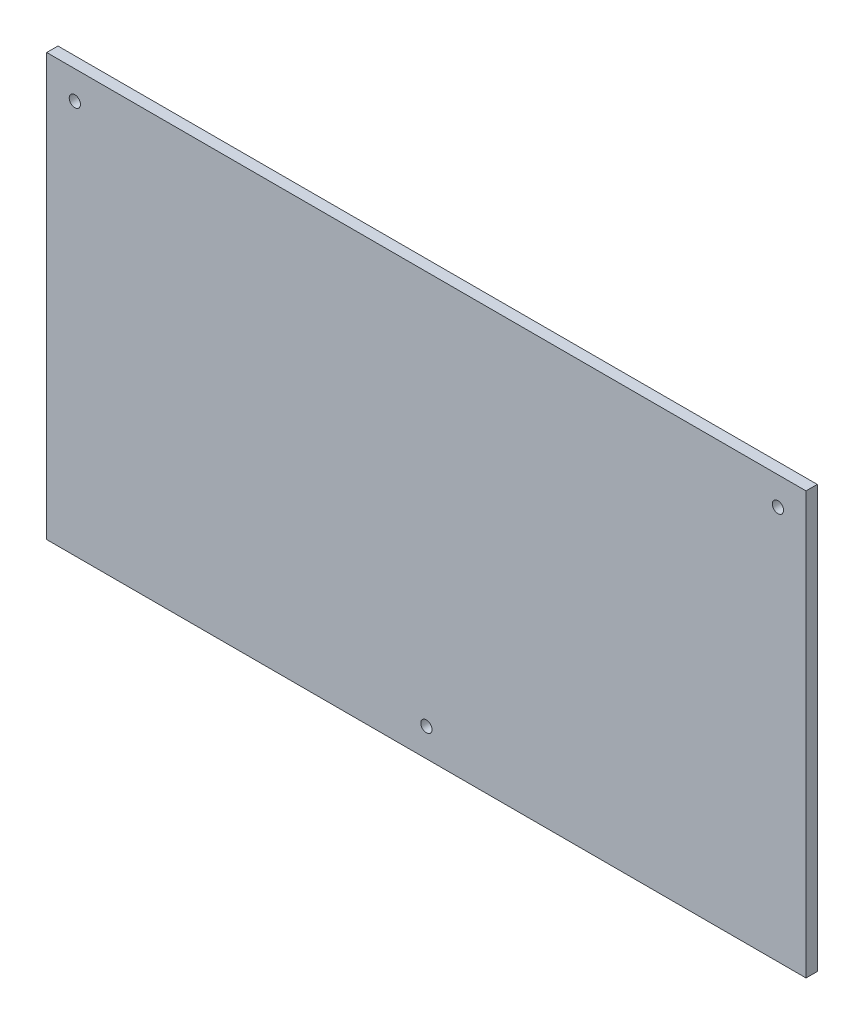
ISO-10303-21;
HEADER;
FILE_DESCRIPTION(('STEP AP214'),'2;1');
FILE_NAME('part.step','',(''),(''),'','','');
FILE_SCHEMA(('AUTOMOTIVE_DESIGN { 1 0 10303 214 1 1 1 1 }'));
ENDSEC;
DATA;
#1=APPLICATION_CONTEXT('core data for automotive mechanical design processes');
#2=APPLICATION_PROTOCOL_DEFINITION('international standard','automotive_design',2000,#1);
#3=PRODUCT_CONTEXT('',#1,'mechanical');
#4=PRODUCT('Part','Part','',(#3));
#5=PRODUCT_RELATED_PRODUCT_CATEGORY('part','',(#4));
#6=PRODUCT_DEFINITION_FORMATION('','',#4);
#7=PRODUCT_DEFINITION_CONTEXT('part definition',#1,'design');
#8=PRODUCT_DEFINITION('design','',#6,#7);
#9=PRODUCT_DEFINITION_SHAPE('','',#8);
#10=(LENGTH_UNIT() NAMED_UNIT(*) SI_UNIT(.MILLI.,.METRE.));
#11=(NAMED_UNIT(*) PLANE_ANGLE_UNIT() SI_UNIT($,.RADIAN.));
#12=(NAMED_UNIT(*) SI_UNIT($,.STERADIAN.) SOLID_ANGLE_UNIT());
#13=UNCERTAINTY_MEASURE_WITH_UNIT(LENGTH_MEASURE(1.E-05),#10,'distance_accuracy_value','');
#14=(GEOMETRIC_REPRESENTATION_CONTEXT(3) GLOBAL_UNCERTAINTY_ASSIGNED_CONTEXT((#13)) GLOBAL_UNIT_ASSIGNED_CONTEXT((#10,
#11,#12)) REPRESENTATION_CONTEXT('',''));
#15=CARTESIAN_POINT('',(0.,0.,0.));
#16=DIRECTION('',(0.,0.,1.));
#17=DIRECTION('',(1.,0.,0.));
#18=AXIS2_PLACEMENT_3D('',#15,#16,#17);
#19=CARTESIAN_POINT('',(0.,0.,4.));
#20=DIRECTION('',(1.,0.,0.));
#21=DIRECTION('',(0.,1.,0.));
#22=AXIS2_PLACEMENT_3D('',#19,#20,#21);
#23=PLANE('',#22);
#24=DIRECTION('',(0.,-1.,0.));
#25=VECTOR('',#24,1.);
#26=CARTESIAN_POINT('',(0.,0.,0.));
#27=LINE('',#26,#25);
#28=CARTESIAN_POINT('',(0.,150.,0.));
#29=VERTEX_POINT('',#28);
#30=CARTESIAN_POINT('',(0.,0.,0.));
#31=VERTEX_POINT('',#30);
#32=EDGE_CURVE('E116',#29,#31,#27,.T.);
#33=ORIENTED_EDGE('',*,*,#32,.T.);
#34=DIRECTION('',(0.,0.,-1.));
#35=VECTOR('',#34,1.);
#36=CARTESIAN_POINT('',(0.,0.,4.));
#37=LINE('',#36,#35);
#38=CARTESIAN_POINT('',(0.,0.,4.));
#39=VERTEX_POINT('',#38);
#40=EDGE_CURVE('E11',#39,#31,#37,.T.);
#41=ORIENTED_EDGE('',*,*,#40,.F.);
#42=DIRECTION('',(0.,-1.,0.));
#43=VECTOR('',#42,1.);
#44=CARTESIAN_POINT('',(0.,0.,4.));
#45=LINE('',#44,#43);
#46=CARTESIAN_POINT('',(0.,150.,4.));
#47=VERTEX_POINT('',#46);
#48=EDGE_CURVE('E98',#47,#39,#45,.T.);
#49=ORIENTED_EDGE('',*,*,#48,.F.);
#50=DIRECTION('',(0.,0.,-1.));
#51=VECTOR('',#50,1.);
#52=CARTESIAN_POINT('',(0.,150.,4.));
#53=LINE('',#52,#51);
#54=EDGE_CURVE('E113',#47,#29,#53,.T.);
#55=ORIENTED_EDGE('',*,*,#54,.T.);
#56=EDGE_LOOP('',(#33,#41,#49,#55));
#57=FACE_BOUND('',#56,.T.);
#58=ADVANCED_FACE('F44',(#57),#23,.F.);
#59=CARTESIAN_POINT('',(0.,0.,4.));
#60=DIRECTION('',(0.,1.,0.));
#61=DIRECTION('',(0.,0.,1.));
#62=AXIS2_PLACEMENT_3D('',#59,#60,#61);
#63=PLANE('',#62);
#64=DIRECTION('',(1.,0.,0.));
#65=VECTOR('',#64,1.);
#66=CARTESIAN_POINT('',(0.,0.,0.));
#67=LINE('',#66,#65);
#68=CARTESIAN_POINT('',(270.,0.,0.));
#69=VERTEX_POINT('',#68);
#70=EDGE_CURVE('E105',#31,#69,#67,.T.);
#71=ORIENTED_EDGE('',*,*,#70,.T.);
#72=DIRECTION('',(0.,0.,-1.));
#73=VECTOR('',#72,1.);
#74=CARTESIAN_POINT('',(270.,0.,4.));
#75=LINE('',#74,#73);
#76=CARTESIAN_POINT('',(270.,0.,4.));
#77=VERTEX_POINT('',#76);
#78=EDGE_CURVE('E53',#77,#69,#75,.T.);
#79=ORIENTED_EDGE('',*,*,#78,.F.);
#80=DIRECTION('',(1.,0.,0.));
#81=VECTOR('',#80,1.);
#82=CARTESIAN_POINT('',(0.,0.,4.));
#83=LINE('',#82,#81);
#84=EDGE_CURVE('E95',#39,#77,#83,.T.);
#85=ORIENTED_EDGE('',*,*,#84,.F.);
#86=ORIENTED_EDGE('',*,*,#40,.T.);
#87=EDGE_LOOP('',(#71,#79,#85,#86));
#88=FACE_BOUND('',#87,.T.);
#89=ADVANCED_FACE('F101',(#88),#63,.F.);
#90=CARTESIAN_POINT('',(270.,0.,4.));
#91=DIRECTION('',(-1.,0.,0.));
#92=DIRECTION('',(0.,0.,1.));
#93=AXIS2_PLACEMENT_3D('',#90,#91,#92);
#94=PLANE('',#93);
#95=DIRECTION('',(0.,1.,0.));
#96=VECTOR('',#95,1.);
#97=CARTESIAN_POINT('',(270.,0.,0.));
#98=LINE('',#97,#96);
#99=CARTESIAN_POINT('',(270.,150.,0.));
#100=VERTEX_POINT('',#99);
#101=EDGE_CURVE('E76',#69,#100,#98,.T.);
#102=ORIENTED_EDGE('',*,*,#101,.T.);
#103=DIRECTION('',(0.,0.,-1.));
#104=VECTOR('',#103,1.);
#105=CARTESIAN_POINT('',(270.,150.,4.));
#106=LINE('',#105,#104);
#107=CARTESIAN_POINT('',(270.,150.,4.));
#108=VERTEX_POINT('',#107);
#109=EDGE_CURVE('E103',#108,#100,#106,.T.);
#110=ORIENTED_EDGE('',*,*,#109,.F.);
#111=DIRECTION('',(0.,1.,0.));
#112=VECTOR('',#111,1.);
#113=CARTESIAN_POINT('',(270.,0.,4.));
#114=LINE('',#113,#112);
#115=EDGE_CURVE('E96',#77,#108,#114,.T.);
#116=ORIENTED_EDGE('',*,*,#115,.F.);
#117=ORIENTED_EDGE('',*,*,#78,.T.);
#118=EDGE_LOOP('',(#102,#110,#116,#117));
#119=FACE_BOUND('',#118,.T.);
#120=ADVANCED_FACE('F102',(#119),#94,.F.);
#121=CARTESIAN_POINT('',(260.,140.,4.));
#122=DIRECTION('',(0.,0.,-1.));
#123=DIRECTION('',(-1.,0.,0.));
#124=AXIS2_PLACEMENT_3D('',#121,#122,#123);
#125=CYLINDRICAL_SURFACE('',#124,2.);
#126=CARTESIAN_POINT('',(260.,140.,4.));
#127=DIRECTION('',(0.,0.,1.));
#128=DIRECTION('',(1.,0.,0.));
#129=AXIS2_PLACEMENT_3D('',#126,#127,#128);
#130=CIRCLE('',#129,2.);
#131=CARTESIAN_POINT('',(262.,140.,4.));
#132=VERTEX_POINT('',#131);
#133=EDGE_CURVE('E106',#132,#132,#130,.T.);
#134=ORIENTED_EDGE('',*,*,#133,.T.);
#135=EDGE_LOOP('',(#134));
#136=FACE_BOUND('',#135,.T.);
#137=CARTESIAN_POINT('',(260.,140.,0.));
#138=DIRECTION('',(0.,0.,1.));
#139=DIRECTION('',(1.,0.,0.));
#140=AXIS2_PLACEMENT_3D('',#137,#138,#139);
#141=CIRCLE('',#140,2.);
#142=CARTESIAN_POINT('',(262.,140.,0.));
#143=VERTEX_POINT('',#142);
#144=EDGE_CURVE('E122',#143,#143,#141,.T.);
#145=ORIENTED_EDGE('',*,*,#144,.F.);
#146=EDGE_LOOP('',(#145));
#147=FACE_BOUND('',#146,.T.);
#148=ADVANCED_FACE('F163',(#136,#147),#125,.F.);
#149=CARTESIAN_POINT('',(0.,150.,4.));
#150=DIRECTION('',(0.,-1.,0.));
#151=DIRECTION('',(1.,0.,0.));
#152=AXIS2_PLACEMENT_3D('',#149,#150,#151);
#153=PLANE('',#152);
#154=DIRECTION('',(-1.,0.,0.));
#155=VECTOR('',#154,1.);
#156=CARTESIAN_POINT('',(0.,150.,0.));
#157=LINE('',#156,#155);
#158=EDGE_CURVE('E82',#100,#29,#157,.T.);
#159=ORIENTED_EDGE('',*,*,#158,.T.);
#160=ORIENTED_EDGE('',*,*,#54,.F.);
#161=DIRECTION('',(-1.,0.,0.));
#162=VECTOR('',#161,1.);
#163=CARTESIAN_POINT('',(0.,150.,4.));
#164=LINE('',#163,#162);
#165=EDGE_CURVE('E65',#108,#47,#164,.T.);
#166=ORIENTED_EDGE('',*,*,#165,.F.);
#167=ORIENTED_EDGE('',*,*,#109,.T.);
#168=EDGE_LOOP('',(#159,#160,#166,#167));
#169=FACE_BOUND('',#168,.T.);
#170=ADVANCED_FACE('F134',(#169),#153,.F.);
#171=CARTESIAN_POINT('',(135.,10.,4.));
#172=DIRECTION('',(0.,0.,-1.));
#173=DIRECTION('',(-1.,0.,0.));
#174=AXIS2_PLACEMENT_3D('',#171,#172,#173);
#175=CYLINDRICAL_SURFACE('',#174,2.);
#176=CARTESIAN_POINT('',(135.,10.,4.));
#177=DIRECTION('',(0.,0.,1.));
#178=DIRECTION('',(1.,0.,0.));
#179=AXIS2_PLACEMENT_3D('',#176,#177,#178);
#180=CIRCLE('',#179,2.);
#181=CARTESIAN_POINT('',(137.,10.,4.));
#182=VERTEX_POINT('',#181);
#183=EDGE_CURVE('E132',#182,#182,#180,.T.);
#184=ORIENTED_EDGE('',*,*,#183,.T.);
#185=EDGE_LOOP('',(#184));
#186=FACE_BOUND('',#185,.T.);
#187=CARTESIAN_POINT('',(135.,10.,0.));
#188=DIRECTION('',(0.,0.,1.));
#189=DIRECTION('',(1.,0.,0.));
#190=AXIS2_PLACEMENT_3D('',#187,#188,#189);
#191=CIRCLE('',#190,2.);
#192=CARTESIAN_POINT('',(137.,10.,0.));
#193=VERTEX_POINT('',#192);
#194=EDGE_CURVE('E117',#193,#193,#191,.T.);
#195=ORIENTED_EDGE('',*,*,#194,.F.);
#196=EDGE_LOOP('',(#195));
#197=FACE_BOUND('',#196,.T.);
#198=ADVANCED_FACE('F50',(#186,#197),#175,.F.);
#199=CARTESIAN_POINT('',(10.,140.,4.));
#200=DIRECTION('',(0.,0.,-1.));
#201=DIRECTION('',(-1.,0.,0.));
#202=AXIS2_PLACEMENT_3D('',#199,#200,#201);
#203=CYLINDRICAL_SURFACE('',#202,2.);
#204=CARTESIAN_POINT('',(10.,140.,4.));
#205=DIRECTION('',(0.,0.,1.));
#206=DIRECTION('',(1.,0.,0.));
#207=AXIS2_PLACEMENT_3D('',#204,#205,#206);
#208=CIRCLE('',#207,2.);
#209=CARTESIAN_POINT('',(12.,140.,4.));
#210=VERTEX_POINT('',#209);
#211=EDGE_CURVE('E115',#210,#210,#208,.T.);
#212=ORIENTED_EDGE('',*,*,#211,.T.);
#213=EDGE_LOOP('',(#212));
#214=FACE_BOUND('',#213,.T.);
#215=CARTESIAN_POINT('',(10.,140.,0.));
#216=DIRECTION('',(0.,0.,1.));
#217=DIRECTION('',(1.,0.,0.));
#218=AXIS2_PLACEMENT_3D('',#215,#216,#217);
#219=CIRCLE('',#218,2.);
#220=CARTESIAN_POINT('',(12.,140.,0.));
#221=VERTEX_POINT('',#220);
#222=EDGE_CURVE('E126',#221,#221,#219,.T.);
#223=ORIENTED_EDGE('',*,*,#222,.F.);
#224=EDGE_LOOP('',(#223));
#225=FACE_BOUND('',#224,.T.);
#226=ADVANCED_FACE('F148',(#214,#225),#203,.F.);
#227=CARTESIAN_POINT('',(0.,0.,4.));
#228=DIRECTION('',(0.,0.,1.));
#229=DIRECTION('',(1.,0.,0.));
#230=AXIS2_PLACEMENT_3D('',#227,#228,#229);
#231=PLANE('',#230);
#232=ORIENTED_EDGE('',*,*,#183,.F.);
#233=EDGE_LOOP('',(#232));
#234=FACE_BOUND('',#233,.T.);
#235=ORIENTED_EDGE('',*,*,#48,.T.);
#236=ORIENTED_EDGE('',*,*,#84,.T.);
#237=ORIENTED_EDGE('',*,*,#115,.T.);
#238=ORIENTED_EDGE('',*,*,#165,.T.);
#239=EDGE_LOOP('',(#235,#236,#237,#238));
#240=FACE_BOUND('',#239,.T.);
#241=ORIENTED_EDGE('',*,*,#133,.F.);
#242=EDGE_LOOP('',(#241));
#243=FACE_BOUND('',#242,.T.);
#244=ORIENTED_EDGE('',*,*,#211,.F.);
#245=EDGE_LOOP('',(#244));
#246=FACE_BOUND('',#245,.T.);
#247=ADVANCED_FACE('F91',(#234,#240,#243,#246),#231,.T.);
#248=CARTESIAN_POINT('',(0.,0.,0.));
#249=DIRECTION('',(0.,0.,1.));
#250=DIRECTION('',(1.,0.,0.));
#251=AXIS2_PLACEMENT_3D('',#248,#249,#250);
#252=PLANE('',#251);
#253=ORIENTED_EDGE('',*,*,#194,.T.);
#254=EDGE_LOOP('',(#253));
#255=FACE_BOUND('',#254,.T.);
#256=ORIENTED_EDGE('',*,*,#32,.F.);
#257=ORIENTED_EDGE('',*,*,#158,.F.);
#258=ORIENTED_EDGE('',*,*,#101,.F.);
#259=ORIENTED_EDGE('',*,*,#70,.F.);
#260=EDGE_LOOP('',(#256,#257,#258,#259));
#261=FACE_BOUND('',#260,.T.);
#262=ORIENTED_EDGE('',*,*,#144,.T.);
#263=EDGE_LOOP('',(#262));
#264=FACE_BOUND('',#263,.T.);
#265=ORIENTED_EDGE('',*,*,#222,.T.);
#266=EDGE_LOOP('',(#265));
#267=FACE_BOUND('',#266,.T.);
#268=ADVANCED_FACE('F139',(#255,#261,#264,#267),#252,.F.);
#269=CLOSED_SHELL('',(#58,#89,#120,#148,#170,#198,#226,#247,#268));
#270=MANIFOLD_SOLID_BREP('B2',#269);
#271=ADVANCED_BREP_SHAPE_REPRESENTATION('',(#18,#270),#14);
#272=SHAPE_DEFINITION_REPRESENTATION(#9,#271);
ENDSEC;
END-ISO-10303-21;
